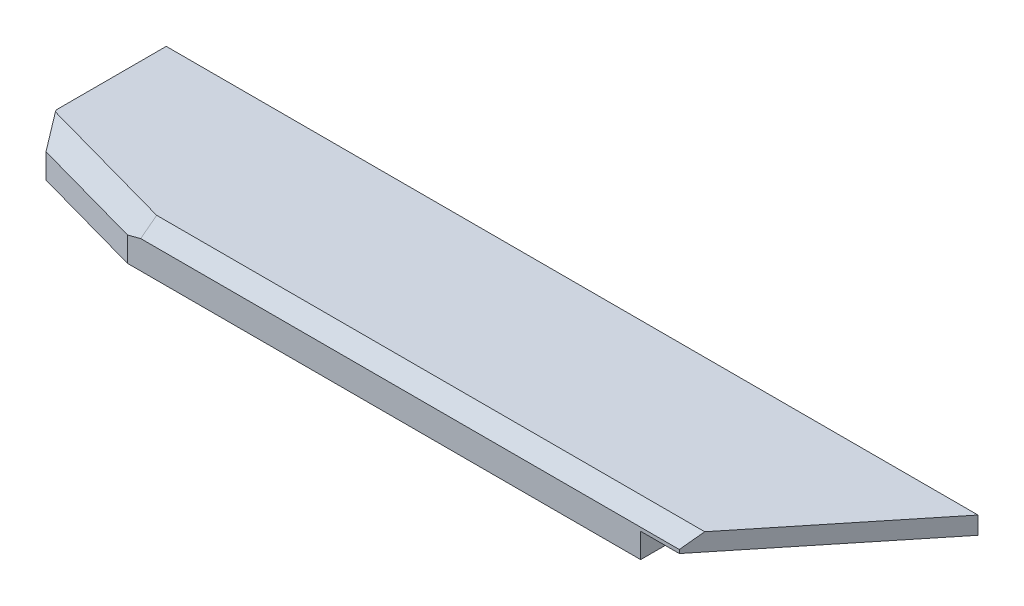
ISO-10303-21;
HEADER;
FILE_DESCRIPTION(('STEP AP214'),'2;1');
FILE_NAME('part.step','',(''),(''),'','','');
FILE_SCHEMA(('AUTOMOTIVE_DESIGN { 1 0 10303 214 1 1 1 1 }'));
ENDSEC;
DATA;
#1=APPLICATION_CONTEXT('core data for automotive mechanical design processes');
#2=APPLICATION_PROTOCOL_DEFINITION('international standard','automotive_design',2000,#1);
#3=PRODUCT_CONTEXT('',#1,'mechanical');
#4=PRODUCT('Part','Part','',(#3));
#5=PRODUCT_RELATED_PRODUCT_CATEGORY('part','',(#4));
#6=PRODUCT_DEFINITION_FORMATION('','',#4);
#7=PRODUCT_DEFINITION_CONTEXT('part definition',#1,'design');
#8=PRODUCT_DEFINITION('design','',#6,#7);
#9=PRODUCT_DEFINITION_SHAPE('','',#8);
#10=(LENGTH_UNIT() NAMED_UNIT(*) SI_UNIT(.MILLI.,.METRE.));
#11=(NAMED_UNIT(*) PLANE_ANGLE_UNIT() SI_UNIT($,.RADIAN.));
#12=(NAMED_UNIT(*) SI_UNIT($,.STERADIAN.) SOLID_ANGLE_UNIT());
#13=UNCERTAINTY_MEASURE_WITH_UNIT(LENGTH_MEASURE(1.E-05),#10,'distance_accuracy_value','');
#14=(GEOMETRIC_REPRESENTATION_CONTEXT(3) GLOBAL_UNCERTAINTY_ASSIGNED_CONTEXT((#13)) GLOBAL_UNIT_ASSIGNED_CONTEXT((#10,
#11,#12)) REPRESENTATION_CONTEXT('',''));
#15=CARTESIAN_POINT('',(0.,0.,0.));
#16=DIRECTION('',(0.,0.,1.));
#17=DIRECTION('',(1.,0.,0.));
#18=AXIS2_PLACEMENT_3D('',#15,#16,#17);
#19=CARTESIAN_POINT('',(-40.7048192771084,3.5,6.02710843373494));
#20=DIRECTION('',(1.,0.,0.));
#21=DIRECTION('',(0.,0.,-1.));
#22=AXIS2_PLACEMENT_3D('',#19,#20,#21);
#23=PLANE('',#22);
#24=DIRECTION('',(0.,0.,1.));
#25=VECTOR('',#24,1.);
#26=CARTESIAN_POINT('',(-40.7048192771084,0.,6.02710843373494));
#27=LINE('',#26,#25);
#28=CARTESIAN_POINT('',(-40.7048192771084,0.,-17.4728915662651));
#29=VERTEX_POINT('',#28);
#30=CARTESIAN_POINT('',(-40.7048192771084,0.,-1.84697490353725));
#31=VERTEX_POINT('',#30);
#32=EDGE_CURVE('E156',#29,#31,#27,.T.);
#33=ORIENTED_EDGE('',*,*,#32,.T.);
#34=DIRECTION('',(0.,1.,0.));
#35=VECTOR('',#34,1.);
#36=CARTESIAN_POINT('',(-40.7048192771084,6.,-1.84697490353725));
#37=LINE('',#36,#35);
#38=CARTESIAN_POINT('',(-40.7048192771084,6.,-1.84697490353725));
#39=VERTEX_POINT('',#38);
#40=EDGE_CURVE('E132',#31,#39,#37,.T.);
#41=ORIENTED_EDGE('',*,*,#40,.T.);
#42=DIRECTION('',(0.,0.,1.));
#43=VECTOR('',#42,1.);
#44=CARTESIAN_POINT('',(-40.7048192771084,6.,-17.4728915662651));
#45=LINE('',#44,#43);
#46=CARTESIAN_POINT('',(-40.7048192771084,6.,-17.4728915662651));
#47=VERTEX_POINT('',#46);
#48=EDGE_CURVE('E130',#47,#39,#45,.T.);
#49=ORIENTED_EDGE('',*,*,#48,.F.);
#50=DIRECTION('',(0.,-1.,0.));
#51=VECTOR('',#50,1.);
#52=CARTESIAN_POINT('',(-40.7048192771084,3.5,-17.4728915662651));
#53=LINE('',#52,#51);
#54=EDGE_CURVE('E113',#47,#29,#53,.T.);
#55=ORIENTED_EDGE('',*,*,#54,.T.);
#56=EDGE_LOOP('',(#33,#41,#49,#55));
#57=FACE_BOUND('',#56,.T.);
#58=ADVANCED_FACE('F37',(#57),#23,.F.);
#59=CARTESIAN_POINT('',(-40.7048192771084,3.5,6.02710843373494));
#60=DIRECTION('',(0.,0.,-1.));
#61=DIRECTION('',(-1.,0.,0.));
#62=AXIS2_PLACEMENT_3D('',#59,#60,#61);
#63=PLANE('',#62);
#64=DIRECTION('',(0.,-1.,0.));
#65=VECTOR('',#64,1.);
#66=CARTESIAN_POINT('',(55.7951807228916,6.,6.02710843373494));
#67=LINE('',#66,#65);
#68=CARTESIAN_POINT('',(55.7951807228916,3.99999999999997,6.02710843373494));
#69=VERTEX_POINT('',#68);
#70=CARTESIAN_POINT('',(55.7951807228916,3.5,6.02710843373494));
#71=VERTEX_POINT('',#70);
#72=EDGE_CURVE('E154',#69,#71,#67,.T.);
#73=ORIENTED_EDGE('',*,*,#72,.F.);
#74=DIRECTION('',(-1.,0.,0.));
#75=VECTOR('',#74,1.);
#76=CARTESIAN_POINT('',(-13.3640484309734,3.99999999999997,6.02710843373494));
#77=LINE('',#76,#75);
#78=CARTESIAN_POINT('',(-20.8366651078814,3.99999999999997,6.02710843373494));
#79=VERTEX_POINT('',#78);
#80=EDGE_CURVE('E46',#69,#79,#77,.T.);
#81=ORIENTED_EDGE('',*,*,#80,.T.);
#82=DIRECTION('',(-0.965999523920123,-0.258543844997507,0.));
#83=VECTOR('',#82,1.);
#84=CARTESIAN_POINT('',(-3.23701117803422,8.71043937908234,6.02710843373494));
#85=LINE('',#84,#83);
#86=CARTESIAN_POINT('',(-22.7048192771082,3.5,6.02710843373494));
#87=VERTEX_POINT('',#86);
#88=EDGE_CURVE('E183',#79,#87,#85,.T.);
#89=ORIENTED_EDGE('',*,*,#88,.T.);
#90=DIRECTION('',(0.,-1.,0.));
#91=VECTOR('',#90,1.);
#92=CARTESIAN_POINT('',(-22.7048192771082,3.5,6.02710843373494));
#93=LINE('',#92,#91);
#94=CARTESIAN_POINT('',(-22.7048192771082,0.,6.02710843373494));
#95=VERTEX_POINT('',#94);
#96=EDGE_CURVE('E169',#87,#95,#93,.T.);
#97=ORIENTED_EDGE('',*,*,#96,.T.);
#98=DIRECTION('',(1.,0.,0.));
#99=VECTOR('',#98,1.);
#100=CARTESIAN_POINT('',(-40.7048192771084,0.,6.02710843373494));
#101=LINE('',#100,#99);
#102=CARTESIAN_POINT('',(50.2951807228916,0.,6.02710843373494));
#103=VERTEX_POINT('',#102);
#104=EDGE_CURVE('E160',#95,#103,#101,.T.);
#105=ORIENTED_EDGE('',*,*,#104,.T.);
#106=DIRECTION('',(0.,-1.,0.));
#107=VECTOR('',#106,1.);
#108=CARTESIAN_POINT('',(50.2951807228916,3.5,6.02710843373494));
#109=LINE('',#108,#107);
#110=CARTESIAN_POINT('',(50.2951807228916,3.5,6.02710843373494));
#111=VERTEX_POINT('',#110);
#112=EDGE_CURVE('E166',#111,#103,#109,.T.);
#113=ORIENTED_EDGE('',*,*,#112,.F.);
#114=DIRECTION('',(1.,0.,0.));
#115=VECTOR('',#114,1.);
#116=CARTESIAN_POINT('',(-40.7048192771084,3.5,6.02710843373494));
#117=LINE('',#116,#115);
#118=EDGE_CURVE('E143',#111,#71,#117,.T.);
#119=ORIENTED_EDGE('',*,*,#118,.T.);
#120=EDGE_LOOP('',(#73,#81,#89,#97,#105,#113,#119));
#121=FACE_BOUND('',#120,.T.);
#122=ADVANCED_FACE('F221',(#121),#63,.F.);
#123=CARTESIAN_POINT('',(50.2951807228916,3.5,6.02710843373494));
#124=DIRECTION('',(-1.,0.,0.));
#125=DIRECTION('',(0.,0.,1.));
#126=AXIS2_PLACEMENT_3D('',#123,#124,#125);
#127=PLANE('',#126);
#128=DIRECTION('',(0.,0.,-1.));
#129=VECTOR('',#128,1.);
#130=CARTESIAN_POINT('',(50.2951807228916,0.,6.02710843373494));
#131=LINE('',#130,#129);
#132=CARTESIAN_POINT('',(50.2951807228916,0.,-17.4728915662651));
#133=VERTEX_POINT('',#132);
#134=EDGE_CURVE('E162',#103,#133,#131,.T.);
#135=ORIENTED_EDGE('',*,*,#134,.T.);
#136=DIRECTION('',(0.,-1.,0.));
#137=VECTOR('',#136,1.);
#138=CARTESIAN_POINT('',(50.2951807228916,3.5,-17.4728915662651));
#139=LINE('',#138,#137);
#140=CARTESIAN_POINT('',(50.2951807228916,3.5,-17.4728915662651));
#141=VERTEX_POINT('',#140);
#142=EDGE_CURVE('E125',#141,#133,#139,.T.);
#143=ORIENTED_EDGE('',*,*,#142,.F.);
#144=DIRECTION('',(0.,0.,-1.));
#145=VECTOR('',#144,1.);
#146=CARTESIAN_POINT('',(50.2951807228916,3.5,6.02710843373494));
#147=LINE('',#146,#145);
#148=EDGE_CURVE('E126',#111,#141,#147,.T.);
#149=ORIENTED_EDGE('',*,*,#148,.F.);
#150=ORIENTED_EDGE('',*,*,#112,.T.);
#151=EDGE_LOOP('',(#135,#143,#149,#150));
#152=FACE_BOUND('',#151,.T.);
#153=ADVANCED_FACE('F203',(#152),#127,.F.);
#154=CARTESIAN_POINT('',(-40.7048192771084,3.5,-17.4728915662651));
#155=DIRECTION('',(0.,0.,1.));
#156=DIRECTION('',(1.,0.,0.));
#157=AXIS2_PLACEMENT_3D('',#154,#155,#156);
#158=PLANE('',#157);
#159=DIRECTION('',(-1.,0.,0.));
#160=VECTOR('',#159,1.);
#161=CARTESIAN_POINT('',(-40.7048192771084,0.,-17.4728915662651));
#162=LINE('',#161,#160);
#163=EDGE_CURVE('E121',#133,#29,#162,.T.);
#164=ORIENTED_EDGE('',*,*,#163,.T.);
#165=ORIENTED_EDGE('',*,*,#54,.F.);
#166=DIRECTION('',(-1.,0.,0.));
#167=VECTOR('',#166,1.);
#168=CARTESIAN_POINT('',(74.7951807228916,6.,-17.4728915662651));
#169=LINE('',#168,#167);
#170=CARTESIAN_POINT('',(74.7951807228916,6.,-17.4728915662651));
#171=VERTEX_POINT('',#170);
#172=EDGE_CURVE('E118',#171,#47,#169,.T.);
#173=ORIENTED_EDGE('',*,*,#172,.F.);
#174=DIRECTION('',(0.,-1.,0.));
#175=VECTOR('',#174,1.);
#176=CARTESIAN_POINT('',(74.7951807228916,6.,-17.4728915662651));
#177=LINE('',#176,#175);
#178=CARTESIAN_POINT('',(74.7951807228916,3.5,-17.4728915662651));
#179=VERTEX_POINT('',#178);
#180=EDGE_CURVE('E147',#171,#179,#177,.T.);
#181=ORIENTED_EDGE('',*,*,#180,.T.);
#182=DIRECTION('',(-1.,0.,0.));
#183=VECTOR('',#182,1.);
#184=CARTESIAN_POINT('',(74.7951807228916,3.5,-17.4728915662651));
#185=LINE('',#184,#183);
#186=EDGE_CURVE('E148',#179,#141,#185,.T.);
#187=ORIENTED_EDGE('',*,*,#186,.T.);
#188=ORIENTED_EDGE('',*,*,#142,.T.);
#189=EDGE_LOOP('',(#164,#165,#173,#181,#187,#188));
#190=FACE_BOUND('',#189,.T.);
#191=ADVANCED_FACE('F115',(#190),#158,.F.);
#192=CARTESIAN_POINT('',(0.,0.,0.));
#193=DIRECTION('',(0.,-1.,0.));
#194=DIRECTION('',(0.,0.,-1.));
#195=AXIS2_PLACEMENT_3D('',#192,#193,#194);
#196=PLANE('',#195);
#197=DIRECTION('',(0.963517909629942,0.,0.267643863786092));
#198=VECTOR('',#197,1.);
#199=CARTESIAN_POINT('',(-3.18068836952388,0.,11.4504781302861));
#200=LINE('',#199,#198);
#201=CARTESIAN_POINT('',(-38.7777834578486,0.,1.56239616130711));
#202=VERTEX_POINT('',#201);
#203=EDGE_CURVE('E171',#95,#202,#200,.F.);
#204=ORIENTED_EDGE('',*,*,#203,.T.);
#205=DIRECTION('',(0.492057256667906,0.,0.870562838720132));
#206=VECTOR('',#205,1.);
#207=CARTESIAN_POINT('',(-30.0581717785568,0.,16.989401440054));
#208=LINE('',#207,#206);
#209=EDGE_CURVE('E179',#202,#31,#208,.F.);
#210=ORIENTED_EDGE('',*,*,#209,.T.);
#211=ORIENTED_EDGE('',*,*,#32,.F.);
#212=ORIENTED_EDGE('',*,*,#163,.F.);
#213=ORIENTED_EDGE('',*,*,#134,.F.);
#214=ORIENTED_EDGE('',*,*,#104,.F.);
#215=EDGE_LOOP('',(#204,#210,#211,#212,#213,#214));
#216=FACE_BOUND('',#215,.T.);
#217=ADVANCED_FACE('F206',(#216),#196,.T.);
#218=CARTESIAN_POINT('',(0.,3.5,0.));
#219=DIRECTION('',(0.,1.,0.));
#220=DIRECTION('',(0.,0.,1.));
#221=AXIS2_PLACEMENT_3D('',#218,#219,#220);
#222=PLANE('',#221);
#223=ORIENTED_EDGE('',*,*,#118,.F.);
#224=ORIENTED_EDGE('',*,*,#148,.T.);
#225=ORIENTED_EDGE('',*,*,#186,.F.);
#226=DIRECTION('',(0.628722149442036,0.,-0.777630026941466));
#227=VECTOR('',#226,1.);
#228=CARTESIAN_POINT('',(55.7951807228916,3.5,6.02710843373494));
#229=LINE('',#228,#227);
#230=EDGE_CURVE('E141',#71,#179,#229,.T.);
#231=ORIENTED_EDGE('',*,*,#230,.F.);
#232=EDGE_LOOP('',(#223,#224,#225,#231));
#233=FACE_BOUND('',#232,.T.);
#234=ADVANCED_FACE('F200',(#233),#222,.F.);
#235=CARTESIAN_POINT('',(55.7951807228916,6.,6.02710843373494));
#236=DIRECTION('',(-0.777630026941466,0.,-0.628722149442036));
#237=DIRECTION('',(-0.628722149442036,0.,0.777630026941467));
#238=AXIS2_PLACEMENT_3D('',#235,#236,#237);
#239=PLANE('',#238);
#240=DIRECTION('',(0.628722149442036,0.,-0.777630026941466));
#241=VECTOR('',#240,1.);
#242=CARTESIAN_POINT('',(55.7951807228916,6.,6.02710843373494));
#243=LINE('',#242,#241);
#244=CARTESIAN_POINT('',(57.4122019994873,6.,4.02710843373492));
#245=VERTEX_POINT('',#244);
#246=EDGE_CURVE('E135',#245,#171,#243,.T.);
#247=ORIENTED_EDGE('',*,*,#246,.F.);
#248=DIRECTION('',(-0.496318758251064,-0.613867937836847,0.613867937836843));
#249=VECTOR('',#248,1.);
#250=CARTESIAN_POINT('',(43.2697216707157,-11.4920151434808,21.5191235772156));
#251=LINE('',#250,#249);
#252=EDGE_CURVE('E60',#245,#69,#251,.T.);
#253=ORIENTED_EDGE('',*,*,#252,.T.);
#254=ORIENTED_EDGE('',*,*,#72,.T.);
#255=ORIENTED_EDGE('',*,*,#230,.T.);
#256=ORIENTED_EDGE('',*,*,#180,.F.);
#257=EDGE_LOOP('',(#247,#253,#254,#255,#256));
#258=FACE_BOUND('',#257,.T.);
#259=ADVANCED_FACE('F195',(#258),#239,.F.);
#260=CARTESIAN_POINT('',(0.,6.,0.));
#261=DIRECTION('',(0.,1.,0.));
#262=DIRECTION('',(0.,0.,1.));
#263=AXIS2_PLACEMENT_3D('',#260,#261,#262);
#264=PLANE('',#263);
#265=DIRECTION('',(0.963517909629942,0.,0.267643863786092));
#266=VECTOR('',#265,1.);
#267=CARTESIAN_POINT('',(-2.51157871005865,6.,9.04168335621123));
#268=LINE('',#267,#266);
#269=CARTESIAN_POINT('',(-40.5174685724582,6.,-1.51550827223297));
#270=VERTEX_POINT('',#269);
#271=CARTESIAN_POINT('',(-20.5640484309736,6.,4.02710843373492));
#272=VERTEX_POINT('',#271);
#273=EDGE_CURVE('E181',#270,#272,#268,.T.);
#274=ORIENTED_EDGE('',*,*,#273,.T.);
#275=DIRECTION('',(1.,0.,0.));
#276=VECTOR('',#275,1.);
#277=CARTESIAN_POINT('',(55.7951807228916,6.,4.02710843373492));
#278=LINE('',#277,#276);
#279=EDGE_CURVE('E189',#272,#245,#278,.T.);
#280=ORIENTED_EDGE('',*,*,#279,.T.);
#281=ORIENTED_EDGE('',*,*,#246,.T.);
#282=ORIENTED_EDGE('',*,*,#172,.T.);
#283=ORIENTED_EDGE('',*,*,#48,.T.);
#284=DIRECTION('',(-0.492057256667906,0.,-0.870562838720132));
#285=VECTOR('',#284,1.);
#286=CARTESIAN_POINT('',(-30.0581717785568,6.,16.989401440054));
#287=LINE('',#286,#285);
#288=EDGE_CURVE('E175',#39,#270,#287,.F.);
#289=ORIENTED_EDGE('',*,*,#288,.T.);
#290=EDGE_LOOP('',(#274,#280,#281,#282,#283,#289));
#291=FACE_BOUND('',#290,.T.);
#292=ADVANCED_FACE('F138',(#291),#264,.T.);
#293=CARTESIAN_POINT('',(-22.7048192771082,3.5,6.02710843373494));
#294=DIRECTION('',(0.267643863786092,0.,-0.963517909629941));
#295=DIRECTION('',(0.,-1.,0.));
#296=AXIS2_PLACEMENT_3D('',#293,#294,#295);
#297=PLANE('',#296);
#298=ORIENTED_EDGE('',*,*,#96,.F.);
#299=DIRECTION('',(0.963517909629942,0.,0.267643863786092));
#300=VECTOR('',#299,1.);
#301=CARTESIAN_POINT('',(-22.7048192771082,3.5,6.02710843373494));
#302=LINE('',#301,#300);
#303=CARTESIAN_POINT('',(-38.7777834578485,3.5,1.56239616130712));
#304=VERTEX_POINT('',#303);
#305=EDGE_CURVE('E185',#87,#304,#302,.F.);
#306=ORIENTED_EDGE('',*,*,#305,.T.);
#307=DIRECTION('',(0.,1.,0.));
#308=VECTOR('',#307,1.);
#309=CARTESIAN_POINT('',(-38.7777834578485,0.,1.56239616130712));
#310=LINE('',#309,#308);
#311=EDGE_CURVE('E177',#304,#202,#310,.F.);
#312=ORIENTED_EDGE('',*,*,#311,.T.);
#313=ORIENTED_EDGE('',*,*,#203,.F.);
#314=EDGE_LOOP('',(#298,#306,#312,#313));
#315=FACE_BOUND('',#314,.T.);
#316=ADVANCED_FACE('F230',(#315),#297,.F.);
#317=CARTESIAN_POINT('',(-40.7048192771084,3.5,-1.84697490353725));
#318=DIRECTION('',(0.870562838720132,0.,-0.492057256667906));
#319=DIRECTION('',(0.,1.,0.));
#320=AXIS2_PLACEMENT_3D('',#317,#318,#319);
#321=PLANE('',#320);
#322=ORIENTED_EDGE('',*,*,#311,.F.);
#323=DIRECTION('',(0.401763067690021,-0.577350269189626,0.710811581297723));
#324=VECTOR('',#323,1.);
#325=CARTESIAN_POINT('',(-40.0624740040218,5.34615384615383,-0.710517881922463));
#326=LINE('',#325,#324);
#327=EDGE_CURVE('E187',#304,#270,#326,.F.);
#328=ORIENTED_EDGE('',*,*,#327,.T.);
#329=ORIENTED_EDGE('',*,*,#288,.F.);
#330=ORIENTED_EDGE('',*,*,#40,.F.);
#331=ORIENTED_EDGE('',*,*,#209,.F.);
#332=EDGE_LOOP('',(#322,#328,#329,#330,#331));
#333=FACE_BOUND('',#332,.T.);
#334=ADVANCED_FACE('F211',(#333),#321,.F.);
#335=CARTESIAN_POINT('',(-2.51157871005865,6.,9.04168335621123));
#336=DIRECTION('',(-0.189252791026114,0.707106781186547,0.681310047694019));
#337=DIRECTION('',(-0.963517909629942,0.,-0.267643863786092));
#338=AXIS2_PLACEMENT_3D('',#335,#336,#337);
#339=PLANE('',#338);
#340=ORIENTED_EDGE('',*,*,#88,.F.);
#341=DIRECTION('',(0.0959399405308866,0.703844985707413,-0.703844985707408));
#342=VECTOR('',#341,1.);
#343=CARTESIAN_POINT('',(-20.7365034043886,4.73481714052764,5.29229129320728));
#344=LINE('',#343,#342);
#345=EDGE_CURVE('E11',#79,#272,#344,.T.);
#346=ORIENTED_EDGE('',*,*,#345,.T.);
#347=ORIENTED_EDGE('',*,*,#273,.F.);
#348=ORIENTED_EDGE('',*,*,#327,.F.);
#349=ORIENTED_EDGE('',*,*,#305,.F.);
#350=EDGE_LOOP('',(#340,#346,#347,#348,#349));
#351=FACE_BOUND('',#350,.T.);
#352=ADVANCED_FACE('F214',(#351),#339,.T.);
#353=CARTESIAN_POINT('',(0.,6.,4.02710843373492));
#354=DIRECTION('',(0.,0.707106781186545,0.70710678118655));
#355=DIRECTION('',(-1.,0.,0.));
#356=AXIS2_PLACEMENT_3D('',#353,#354,#355);
#357=PLANE('',#356);
#358=ORIENTED_EDGE('',*,*,#345,.F.);
#359=ORIENTED_EDGE('',*,*,#80,.F.);
#360=ORIENTED_EDGE('',*,*,#252,.F.);
#361=ORIENTED_EDGE('',*,*,#279,.F.);
#362=EDGE_LOOP('',(#358,#359,#360,#361));
#363=FACE_BOUND('',#362,.T.);
#364=ADVANCED_FACE('F40',(#363),#357,.T.);
#365=CLOSED_SHELL('',(#58,#122,#153,#191,#217,#234,#259,#292,#316,#334,#352,#364));
#366=MANIFOLD_SOLID_BREP('B2',#365);
#367=ADVANCED_BREP_SHAPE_REPRESENTATION('',(#18,#366),#14);
#368=SHAPE_DEFINITION_REPRESENTATION(#9,#367);
ENDSEC;
END-ISO-10303-21;
